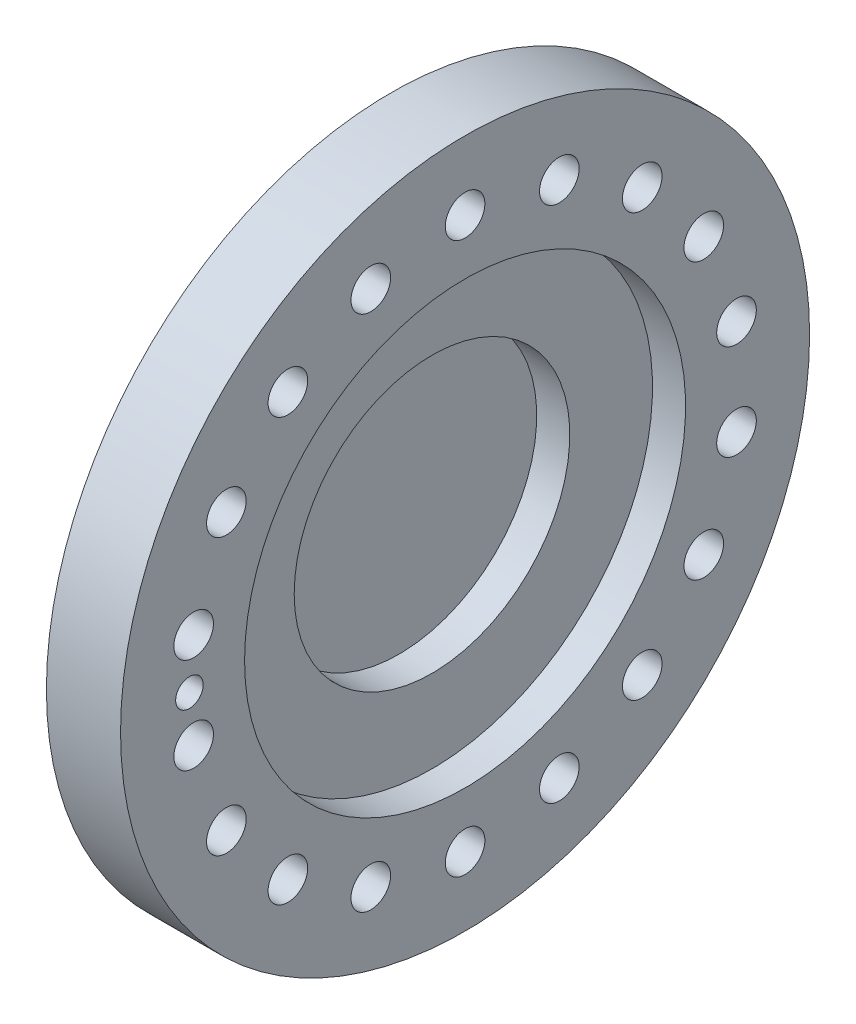
ISO-10303-21;
HEADER;
FILE_DESCRIPTION(('STEP AP214'),'2;1');
FILE_NAME('part.step','',(''),(''),'','','');
FILE_SCHEMA(('AUTOMOTIVE_DESIGN { 1 0 10303 214 1 1 1 1 }'));
ENDSEC;
DATA;
#1=APPLICATION_CONTEXT('core data for automotive mechanical design processes');
#2=APPLICATION_PROTOCOL_DEFINITION('international standard','automotive_design',2000,#1);
#3=PRODUCT_CONTEXT('',#1,'mechanical');
#4=PRODUCT('Part','Part','',(#3));
#5=PRODUCT_RELATED_PRODUCT_CATEGORY('part','',(#4));
#6=PRODUCT_DEFINITION_FORMATION('','',#4);
#7=PRODUCT_DEFINITION_CONTEXT('part definition',#1,'design');
#8=PRODUCT_DEFINITION('design','',#6,#7);
#9=PRODUCT_DEFINITION_SHAPE('','',#8);
#10=(LENGTH_UNIT() NAMED_UNIT(*) SI_UNIT(.MILLI.,.METRE.));
#11=(NAMED_UNIT(*) PLANE_ANGLE_UNIT() SI_UNIT($,.RADIAN.));
#12=(NAMED_UNIT(*) SI_UNIT($,.STERADIAN.) SOLID_ANGLE_UNIT());
#13=UNCERTAINTY_MEASURE_WITH_UNIT(LENGTH_MEASURE(1.E-05),#10,'distance_accuracy_value','');
#14=(GEOMETRIC_REPRESENTATION_CONTEXT(3) GLOBAL_UNCERTAINTY_ASSIGNED_CONTEXT((#13)) GLOBAL_UNIT_ASSIGNED_CONTEXT((#10,
#11,#12)) REPRESENTATION_CONTEXT('',''));
#15=CARTESIAN_POINT('',(0.,0.,0.));
#16=DIRECTION('',(0.,0.,1.));
#17=DIRECTION('',(1.,0.,0.));
#18=AXIS2_PLACEMENT_3D('',#15,#16,#17);
#19=CARTESIAN_POINT('',(2148.,26.0000000000061,2565.));
#20=DIRECTION('',(-1.,0.,0.));
#21=DIRECTION('',(0.,0.,1.));
#22=AXIS2_PLACEMENT_3D('',#19,#20,#21);
#23=PLANE('',#22);
#24=CARTESIAN_POINT('',(2148.,6.13918638148192E-12,2565.));
#25=DIRECTION('',(-1.,0.,0.));
#26=DIRECTION('',(0.,0.,1.));
#27=AXIS2_PLACEMENT_3D('',#24,#25,#26);
#28=CIRCLE('',#27,50.);
#29=CARTESIAN_POINT('',(2148.,6.13918638148192E-12,2615.));
#30=VERTEX_POINT('',#29);
#31=EDGE_CURVE('E149',#30,#30,#28,.T.);
#32=ORIENTED_EDGE('',*,*,#31,.F.);
#33=EDGE_LOOP('',(#32));
#34=FACE_BOUND('',#33,.T.);
#35=ADVANCED_FACE('F15',(#34),#23,.F.);
#36=CARTESIAN_POINT('',(2058.1,6.13918638148192E-12,2565.));
#37=DIRECTION('',(-1.,0.,0.));
#38=DIRECTION('',(0.,0.,1.));
#39=AXIS2_PLACEMENT_3D('',#36,#37,#38);
#40=CYLINDRICAL_SURFACE('',#39,50.);
#41=ORIENTED_EDGE('',*,*,#31,.T.);
#42=EDGE_LOOP('',(#41));
#43=FACE_BOUND('',#42,.T.);
#44=CARTESIAN_POINT('',(2160.,6.13918638148192E-12,2565.));
#45=DIRECTION('',(-1.,0.,0.));
#46=DIRECTION('',(0.,0.,1.));
#47=AXIS2_PLACEMENT_3D('',#44,#45,#46);
#48=CIRCLE('',#47,50.);
#49=CARTESIAN_POINT('',(2160.,6.13918638148192E-12,2615.));
#50=VERTEX_POINT('',#49);
#51=EDGE_CURVE('E27',#50,#50,#48,.T.);
#52=ORIENTED_EDGE('',*,*,#51,.F.);
#53=EDGE_LOOP('',(#52));
#54=FACE_BOUND('',#53,.T.);
#55=ADVANCED_FACE('F157',(#43,#54),#40,.F.);
#56=CARTESIAN_POINT('',(2160.,80.0000000000062,2565.));
#57=DIRECTION('',(1.,0.,0.));
#58=DIRECTION('',(0.,0.,-1.));
#59=AXIS2_PLACEMENT_3D('',#56,#57,#58);
#60=PLANE('',#59);
#61=ORIENTED_EDGE('',*,*,#51,.T.);
#62=EDGE_LOOP('',(#61));
#63=FACE_BOUND('',#62,.T.);
#64=CARTESIAN_POINT('',(2160.,6.13918638148192E-12,2565.));
#65=DIRECTION('',(-1.,0.,0.));
#66=DIRECTION('',(0.,0.,1.));
#67=AXIS2_PLACEMENT_3D('',#64,#65,#66);
#68=CIRCLE('',#67,80.);
#69=CARTESIAN_POINT('',(2160.,6.13918638148192E-12,2645.));
#70=VERTEX_POINT('',#69);
#71=EDGE_CURVE('E19',#70,#70,#68,.T.);
#72=ORIENTED_EDGE('',*,*,#71,.F.);
#73=EDGE_LOOP('',(#72));
#74=FACE_BOUND('',#73,.T.);
#75=ADVANCED_FACE('F154',(#63,#74),#60,.T.);
#76=CARTESIAN_POINT('',(2157.,6.11143080586629E-12,2665.));
#77=DIRECTION('',(-1.,0.,0.));
#78=DIRECTION('',(0.,0.,1.));
#79=AXIS2_PLACEMENT_3D('',#76,#77,#78);
#80=PLANE('',#79);
#81=CARTESIAN_POINT('',(2157.,6.11143080586629E-12,2665.));
#82=DIRECTION('',(-1.,0.,0.));
#83=DIRECTION('',(0.,0.,1.));
#84=AXIS2_PLACEMENT_3D('',#81,#82,#83);
#85=CIRCLE('',#84,5.);
#86=CARTESIAN_POINT('',(2157.,6.11143080586629E-12,2670.));
#87=VERTEX_POINT('',#86);
#88=EDGE_CURVE('E138',#87,#87,#85,.T.);
#89=ORIENTED_EDGE('',*,*,#88,.F.);
#90=EDGE_LOOP('',(#89));
#91=FACE_BOUND('',#90,.T.);
#92=ADVANCED_FACE('F166',(#91),#80,.F.);
#93=CARTESIAN_POINT('',(2152.,100.000000000006,2565.));
#94=DIRECTION('',(-1.,0.,0.));
#95=DIRECTION('',(0.,0.,1.));
#96=AXIS2_PLACEMENT_3D('',#93,#94,#95);
#97=PLANE('',#96);
#98=CARTESIAN_POINT('',(2152.,100.000000000006,2565.));
#99=DIRECTION('',(-1.,0.,0.));
#100=DIRECTION('',(0.,0.,1.));
#101=AXIS2_PLACEMENT_3D('',#98,#99,#100);
#102=CIRCLE('',#101,7.1881);
#103=CARTESIAN_POINT('',(2152.,100.000000000006,2572.1881));
#104=VERTEX_POINT('',#103);
#105=EDGE_CURVE('E132',#104,#104,#102,.T.);
#106=ORIENTED_EDGE('',*,*,#105,.F.);
#107=EDGE_LOOP('',(#106));
#108=FACE_BOUND('',#107,.T.);
#109=ADVANCED_FACE('F186',(#108),#97,.F.);
#110=CARTESIAN_POINT('',(2152.,93.9692620785969,2599.20201433256));
#111=DIRECTION('',(-1.,0.,0.));
#112=DIRECTION('',(0.,-0.342020143325668,0.939692620785908));
#113=AXIS2_PLACEMENT_3D('',#110,#111,#112);
#114=PLANE('',#113);
#115=CARTESIAN_POINT('',(2152.,93.9692620785969,2599.20201433256));
#116=DIRECTION('',(-1.,0.,0.));
#117=DIRECTION('',(0.,-0.342020143325668,0.939692620785908));
#118=AXIS2_PLACEMENT_3D('',#115,#116,#117);
#119=CIRCLE('',#118,7.1881);
#120=CARTESIAN_POINT('',(2152.,91.5107870863577,2605.95661886004));
#121=VERTEX_POINT('',#120);
#122=EDGE_CURVE('E126',#121,#121,#119,.T.);
#123=ORIENTED_EDGE('',*,*,#122,.F.);
#124=EDGE_LOOP('',(#123));
#125=FACE_BOUND('',#124,.T.);
#126=ADVANCED_FACE('F194',(#125),#114,.F.);
#127=CARTESIAN_POINT('',(2152.,76.604444311904,2629.27876096866));
#128=DIRECTION('',(-1.,0.,0.));
#129=DIRECTION('',(0.,-0.642787609686539,0.766044443118978));
#130=AXIS2_PLACEMENT_3D('',#127,#128,#129);
#131=PLANE('',#130);
#132=CARTESIAN_POINT('',(2152.,76.604444311904,2629.27876096866));
#133=DIRECTION('',(-1.,0.,0.));
#134=DIRECTION('',(0.,-0.642787609686539,0.766044443118978));
#135=AXIS2_PLACEMENT_3D('',#132,#133,#134);
#136=CIRCLE('',#135,7.1881);
#137=CARTESIAN_POINT('',(2152.,71.9840226947162,2634.78516503024));
#138=VERTEX_POINT('',#137);
#139=EDGE_CURVE('E120',#138,#138,#136,.T.);
#140=ORIENTED_EDGE('',*,*,#139,.F.);
#141=EDGE_LOOP('',(#140));
#142=FACE_BOUND('',#141,.T.);
#143=ADVANCED_FACE('F202',(#142),#131,.F.);
#144=CARTESIAN_POINT('',(2152.,50.0000000000061,2651.60254037844));
#145=DIRECTION('',(-1.,0.,0.));
#146=DIRECTION('',(0.,-0.866025403784439,0.5));
#147=AXIS2_PLACEMENT_3D('',#144,#145,#146);
#148=PLANE('',#147);
#149=CARTESIAN_POINT('',(2152.,50.0000000000061,2651.60254037844));
#150=DIRECTION('',(-1.,0.,0.));
#151=DIRECTION('',(0.,-0.866025403784439,0.5));
#152=AXIS2_PLACEMENT_3D('',#149,#150,#151);
#153=CIRCLE('',#152,7.1881);
#154=CARTESIAN_POINT('',(2152.,43.7749227950632,2655.19659037844));
#155=VERTEX_POINT('',#154);
#156=EDGE_CURVE('E114',#155,#155,#153,.T.);
#157=ORIENTED_EDGE('',*,*,#156,.F.);
#158=EDGE_LOOP('',(#157));
#159=FACE_BOUND('',#158,.T.);
#160=ADVANCED_FACE('F210',(#159),#148,.F.);
#161=CARTESIAN_POINT('',(2152.,17.3648177666993,2663.48077530122));
#162=DIRECTION('',(-1.,0.,0.));
#163=DIRECTION('',(0.,-0.984807753012208,0.17364817766693));
#164=AXIS2_PLACEMENT_3D('',#161,#162,#163);
#165=PLANE('',#164);
#166=CARTESIAN_POINT('',(2152.,17.3648177666993,2663.48077530122));
#167=DIRECTION('',(-1.,0.,0.));
#168=DIRECTION('',(0.,-0.984807753012208,0.17364817766693));
#169=AXIS2_PLACEMENT_3D('',#166,#167,#168);
#170=CIRCLE('',#169,7.1881);
#171=CARTESIAN_POINT('',(2152.,10.2859211572722,2664.72897576711));
#172=VERTEX_POINT('',#171);
#173=EDGE_CURVE('E108',#172,#172,#170,.T.);
#174=ORIENTED_EDGE('',*,*,#173,.F.);
#175=EDGE_LOOP('',(#174));
#176=FACE_BOUND('',#175,.T.);
#177=ADVANCED_FACE('F218',(#176),#165,.F.);
#178=CARTESIAN_POINT('',(2152.,-17.3648177666869,2663.48077530122));
#179=DIRECTION('',(-1.,0.,0.));
#180=DIRECTION('',(0.,-0.984807753012208,-0.17364817766693));
#181=AXIS2_PLACEMENT_3D('',#178,#179,#180);
#182=PLANE('',#181);
#183=CARTESIAN_POINT('',(2152.,-17.3648177666869,2663.48077530122));
#184=DIRECTION('',(-1.,0.,0.));
#185=DIRECTION('',(0.,-0.984807753012208,-0.17364817766693));
#186=AXIS2_PLACEMENT_3D('',#183,#184,#185);
#187=CIRCLE('',#186,7.1881);
#188=CARTESIAN_POINT('',(2152.,-24.4437143761139,2662.23257483533));
#189=VERTEX_POINT('',#188);
#190=EDGE_CURVE('E102',#189,#189,#187,.T.);
#191=ORIENTED_EDGE('',*,*,#190,.F.);
#192=EDGE_LOOP('',(#191));
#193=FACE_BOUND('',#192,.T.);
#194=ADVANCED_FACE('F226',(#193),#182,.F.);
#195=CARTESIAN_POINT('',(2152.,-49.9999999999939,2651.60254037844));
#196=DIRECTION('',(-1.,0.,0.));
#197=DIRECTION('',(0.,-0.866025403784439,-0.5));
#198=AXIS2_PLACEMENT_3D('',#195,#196,#197);
#199=PLANE('',#198);
#200=CARTESIAN_POINT('',(2152.,-49.9999999999939,2651.60254037844));
#201=DIRECTION('',(-1.,0.,0.));
#202=DIRECTION('',(0.,-0.866025403784439,-0.5));
#203=AXIS2_PLACEMENT_3D('',#200,#201,#202);
#204=CIRCLE('',#203,7.1881);
#205=CARTESIAN_POINT('',(2152.,-56.2250772049368,2648.00849037845));
#206=VERTEX_POINT('',#205);
#207=EDGE_CURVE('E96',#206,#206,#204,.T.);
#208=ORIENTED_EDGE('',*,*,#207,.F.);
#209=EDGE_LOOP('',(#208));
#210=FACE_BOUND('',#209,.T.);
#211=ADVANCED_FACE('F234',(#210),#199,.F.);
#212=CARTESIAN_POINT('',(2152.,-76.6044443118917,2629.27876096866));
#213=DIRECTION('',(-1.,0.,0.));
#214=DIRECTION('',(0.,-0.64278760968654,-0.766044443118978));
#215=AXIS2_PLACEMENT_3D('',#212,#213,#214);
#216=PLANE('',#215);
#217=CARTESIAN_POINT('',(2152.,-76.6044443118917,2629.27876096866));
#218=DIRECTION('',(-1.,0.,0.));
#219=DIRECTION('',(0.,-0.64278760968654,-0.766044443118978));
#220=AXIS2_PLACEMENT_3D('',#217,#218,#219);
#221=CIRCLE('',#220,7.1881);
#222=CARTESIAN_POINT('',(2152.,-81.2248659290795,2623.77235690707));
#223=VERTEX_POINT('',#222);
#224=EDGE_CURVE('E90',#223,#223,#221,.T.);
#225=ORIENTED_EDGE('',*,*,#224,.F.);
#226=EDGE_LOOP('',(#225));
#227=FACE_BOUND('',#226,.T.);
#228=ADVANCED_FACE('F242',(#227),#216,.F.);
#229=CARTESIAN_POINT('',(2152.,-93.9692620785847,2599.20201433256));
#230=DIRECTION('',(-1.,0.,0.));
#231=DIRECTION('',(0.,-0.342020143325669,-0.939692620785909));
#232=AXIS2_PLACEMENT_3D('',#229,#230,#231);
#233=PLANE('',#232);
#234=CARTESIAN_POINT('',(2152.,-93.9692620785847,2599.20201433256));
#235=DIRECTION('',(-1.,0.,0.));
#236=DIRECTION('',(0.,-0.342020143325669,-0.939692620785909));
#237=AXIS2_PLACEMENT_3D('',#234,#235,#236);
#238=CIRCLE('',#237,7.1881);
#239=CARTESIAN_POINT('',(2152.,-96.4277370708239,2592.44740980509));
#240=VERTEX_POINT('',#239);
#241=EDGE_CURVE('E84',#240,#240,#238,.T.);
#242=ORIENTED_EDGE('',*,*,#241,.F.);
#243=EDGE_LOOP('',(#242));
#244=FACE_BOUND('',#243,.T.);
#245=ADVANCED_FACE('F250',(#244),#233,.F.);
#246=CARTESIAN_POINT('',(2152.,-99.9999999999939,2565.));
#247=DIRECTION('',(-1.,0.,0.));
#248=DIRECTION('',(0.,0.,-1.));
#249=AXIS2_PLACEMENT_3D('',#246,#247,#248);
#250=PLANE('',#249);
#251=CARTESIAN_POINT('',(2152.,-99.9999999999939,2565.));
#252=DIRECTION('',(-1.,0.,0.));
#253=DIRECTION('',(0.,0.,-1.));
#254=AXIS2_PLACEMENT_3D('',#251,#252,#253);
#255=CIRCLE('',#254,7.1881);
#256=CARTESIAN_POINT('',(2152.,-99.9999999999939,2557.8119));
#257=VERTEX_POINT('',#256);
#258=EDGE_CURVE('E78',#257,#257,#255,.T.);
#259=ORIENTED_EDGE('',*,*,#258,.F.);
#260=EDGE_LOOP('',(#259));
#261=FACE_BOUND('',#260,.T.);
#262=ADVANCED_FACE('F258',(#261),#250,.F.);
#263=CARTESIAN_POINT('',(2152.,-93.9692620785848,2530.79798566744));
#264=DIRECTION('',(-1.,0.,0.));
#265=DIRECTION('',(0.,0.342020143325668,-0.939692620785909));
#266=AXIS2_PLACEMENT_3D('',#263,#264,#265);
#267=PLANE('',#266);
#268=CARTESIAN_POINT('',(2152.,-93.9692620785848,2530.79798566744));
#269=DIRECTION('',(-1.,0.,0.));
#270=DIRECTION('',(0.,0.342020143325668,-0.939692620785909));
#271=AXIS2_PLACEMENT_3D('',#268,#269,#270);
#272=CIRCLE('',#271,7.1881);
#273=CARTESIAN_POINT('',(2152.,-91.5107870863456,2524.04338113996));
#274=VERTEX_POINT('',#273);
#275=EDGE_CURVE('E72',#274,#274,#272,.T.);
#276=ORIENTED_EDGE('',*,*,#275,.F.);
#277=EDGE_LOOP('',(#276));
#278=FACE_BOUND('',#277,.T.);
#279=ADVANCED_FACE('F266',(#278),#267,.F.);
#280=CARTESIAN_POINT('',(2152.,-76.6044443118918,2500.72123903134));
#281=DIRECTION('',(-1.,0.,0.));
#282=DIRECTION('',(0.,0.642787609686539,-0.766044443118979));
#283=AXIS2_PLACEMENT_3D('',#280,#281,#282);
#284=PLANE('',#283);
#285=CARTESIAN_POINT('',(2152.,-76.6044443118918,2500.72123903134));
#286=DIRECTION('',(-1.,0.,0.));
#287=DIRECTION('',(0.,0.642787609686539,-0.766044443118979));
#288=AXIS2_PLACEMENT_3D('',#285,#286,#287);
#289=CIRCLE('',#288,7.1881);
#290=CARTESIAN_POINT('',(2152.,-71.984022694704,2495.21483496976));
#291=VERTEX_POINT('',#290);
#292=EDGE_CURVE('E66',#291,#291,#289,.T.);
#293=ORIENTED_EDGE('',*,*,#292,.F.);
#294=EDGE_LOOP('',(#293));
#295=FACE_BOUND('',#294,.T.);
#296=ADVANCED_FACE('F274',(#295),#284,.F.);
#297=CARTESIAN_POINT('',(2152.,-49.9999999999939,2478.39745962156));
#298=DIRECTION('',(-1.,0.,0.));
#299=DIRECTION('',(0.,0.866025403784439,-0.5));
#300=AXIS2_PLACEMENT_3D('',#297,#298,#299);
#301=PLANE('',#300);
#302=CARTESIAN_POINT('',(2152.,-49.9999999999939,2478.39745962156));
#303=DIRECTION('',(-1.,0.,0.));
#304=DIRECTION('',(0.,0.866025403784439,-0.5));
#305=AXIS2_PLACEMENT_3D('',#302,#303,#304);
#306=CIRCLE('',#305,7.1881);
#307=CARTESIAN_POINT('',(2152.,-43.774922795051,2474.80340962156));
#308=VERTEX_POINT('',#307);
#309=EDGE_CURVE('E60',#308,#308,#306,.T.);
#310=ORIENTED_EDGE('',*,*,#309,.F.);
#311=EDGE_LOOP('',(#310));
#312=FACE_BOUND('',#311,.T.);
#313=ADVANCED_FACE('F282',(#312),#301,.F.);
#314=CARTESIAN_POINT('',(2152.,-17.364817766687,2466.51922469878));
#315=DIRECTION('',(-1.,0.,0.));
#316=DIRECTION('',(0.,0.984807753012208,-0.173648177666931));
#317=AXIS2_PLACEMENT_3D('',#314,#315,#316);
#318=PLANE('',#317);
#319=CARTESIAN_POINT('',(2152.,-17.364817766687,2466.51922469878));
#320=DIRECTION('',(-1.,0.,0.));
#321=DIRECTION('',(0.,0.984807753012208,-0.173648177666931));
#322=AXIS2_PLACEMENT_3D('',#319,#320,#321);
#323=CIRCLE('',#322,7.1881);
#324=CARTESIAN_POINT('',(2152.,-10.2859211572599,2465.27102423289));
#325=VERTEX_POINT('',#324);
#326=EDGE_CURVE('E54',#325,#325,#323,.T.);
#327=ORIENTED_EDGE('',*,*,#326,.F.);
#328=EDGE_LOOP('',(#327));
#329=FACE_BOUND('',#328,.T.);
#330=ADVANCED_FACE('F290',(#329),#318,.F.);
#331=CARTESIAN_POINT('',(2152.,17.3648177666992,2466.51922469878));
#332=DIRECTION('',(-1.,0.,0.));
#333=DIRECTION('',(0.,0.984807753012209,0.17364817766693));
#334=AXIS2_PLACEMENT_3D('',#331,#332,#333);
#335=PLANE('',#334);
#336=CARTESIAN_POINT('',(2152.,17.3648177666992,2466.51922469878));
#337=DIRECTION('',(-1.,0.,0.));
#338=DIRECTION('',(0.,0.984807753012209,0.17364817766693));
#339=AXIS2_PLACEMENT_3D('',#336,#337,#338);
#340=CIRCLE('',#339,7.1881);
#341=CARTESIAN_POINT('',(2152.,24.4437143761262,2467.76742516467));
#342=VERTEX_POINT('',#341);
#343=EDGE_CURVE('E48',#342,#342,#340,.T.);
#344=ORIENTED_EDGE('',*,*,#343,.F.);
#345=EDGE_LOOP('',(#344));
#346=FACE_BOUND('',#345,.T.);
#347=ADVANCED_FACE('F298',(#346),#335,.F.);
#348=CARTESIAN_POINT('',(2152.,50.0000000000061,2478.39745962156));
#349=DIRECTION('',(-1.,0.,0.));
#350=DIRECTION('',(0.,0.866025403784439,0.5));
#351=AXIS2_PLACEMENT_3D('',#348,#349,#350);
#352=PLANE('',#351);
#353=CARTESIAN_POINT('',(2152.,50.0000000000061,2478.39745962156));
#354=DIRECTION('',(-1.,0.,0.));
#355=DIRECTION('',(0.,0.866025403784439,0.5));
#356=AXIS2_PLACEMENT_3D('',#353,#354,#355);
#357=CIRCLE('',#356,7.1881);
#358=CARTESIAN_POINT('',(2152.,56.225077204949,2481.99150962155));
#359=VERTEX_POINT('',#358);
#360=EDGE_CURVE('E42',#359,#359,#357,.T.);
#361=ORIENTED_EDGE('',*,*,#360,.F.);
#362=EDGE_LOOP('',(#361));
#363=FACE_BOUND('',#362,.T.);
#364=ADVANCED_FACE('F306',(#363),#352,.F.);
#365=CARTESIAN_POINT('',(2152.,76.6044443119041,2500.72123903134));
#366=DIRECTION('',(-1.,0.,0.));
#367=DIRECTION('',(0.,0.64278760968654,0.766044443118978));
#368=AXIS2_PLACEMENT_3D('',#365,#366,#367);
#369=PLANE('',#368);
#370=CARTESIAN_POINT('',(2152.,76.6044443119041,2500.72123903134));
#371=DIRECTION('',(-1.,0.,0.));
#372=DIRECTION('',(0.,0.64278760968654,0.766044443118978));
#373=AXIS2_PLACEMENT_3D('',#370,#371,#372);
#374=CIRCLE('',#373,7.1881);
#375=CARTESIAN_POINT('',(2152.,81.2248659290919,2506.22764309293));
#376=VERTEX_POINT('',#375);
#377=EDGE_CURVE('E36',#376,#376,#374,.T.);
#378=ORIENTED_EDGE('',*,*,#377,.F.);
#379=EDGE_LOOP('',(#378));
#380=FACE_BOUND('',#379,.T.);
#381=ADVANCED_FACE('F314',(#380),#369,.F.);
#382=CARTESIAN_POINT('',(2152.,93.969262078597,2530.79798566743));
#383=DIRECTION('',(-1.,0.,0.));
#384=DIRECTION('',(0.,0.342020143325669,0.939692620785909));
#385=AXIS2_PLACEMENT_3D('',#382,#383,#384);
#386=PLANE('',#385);
#387=CARTESIAN_POINT('',(2152.,93.969262078597,2530.79798566743));
#388=DIRECTION('',(-1.,0.,0.));
#389=DIRECTION('',(0.,0.342020143325669,0.939692620785909));
#390=AXIS2_PLACEMENT_3D('',#387,#388,#389);
#391=CIRCLE('',#390,7.1881);
#392=CARTESIAN_POINT('',(2152.,96.4277370708363,2537.5525901949));
#393=VERTEX_POINT('',#392);
#394=EDGE_CURVE('E29',#393,#393,#391,.T.);
#395=ORIENTED_EDGE('',*,*,#394,.F.);
#396=EDGE_LOOP('',(#395));
#397=FACE_BOUND('',#396,.T.);
#398=ADVANCED_FACE('F321',(#397),#386,.F.);
#399=CARTESIAN_POINT('',(2058.1,6.13918638148192E-12,2565.));
#400=DIRECTION('',(-1.,0.,0.));
#401=DIRECTION('',(0.,0.,1.));
#402=AXIS2_PLACEMENT_3D('',#399,#400,#401);
#403=CYLINDRICAL_SURFACE('',#402,80.);
#404=ORIENTED_EDGE('',*,*,#71,.T.);
#405=EDGE_LOOP('',(#404));
#406=FACE_BOUND('',#405,.T.);
#407=CARTESIAN_POINT('',(2172.,6.13918638148192E-12,2565.));
#408=DIRECTION('',(-1.,0.,0.));
#409=DIRECTION('',(0.,0.,1.));
#410=AXIS2_PLACEMENT_3D('',#407,#408,#409);
#411=CIRCLE('',#410,80.);
#412=CARTESIAN_POINT('',(2172.,6.13918638148192E-12,2645.));
#413=VERTEX_POINT('',#412);
#414=EDGE_CURVE('E141',#413,#413,#411,.T.);
#415=ORIENTED_EDGE('',*,*,#414,.F.);
#416=EDGE_LOOP('',(#415));
#417=FACE_BOUND('',#416,.T.);
#418=ADVANCED_FACE('F17',(#406,#417),#403,.F.);
#419=CARTESIAN_POINT('',(2172.,6.11143080586629E-12,2665.));
#420=DIRECTION('',(-1.,0.,0.));
#421=DIRECTION('',(0.,0.,1.));
#422=AXIS2_PLACEMENT_3D('',#419,#420,#421);
#423=CYLINDRICAL_SURFACE('',#422,5.);
#424=ORIENTED_EDGE('',*,*,#88,.T.);
#425=EDGE_LOOP('',(#424));
#426=FACE_BOUND('',#425,.T.);
#427=CARTESIAN_POINT('',(2172.,6.11143080586629E-12,2665.));
#428=DIRECTION('',(-1.,0.,0.));
#429=DIRECTION('',(0.,0.,1.));
#430=AXIS2_PLACEMENT_3D('',#427,#428,#429);
#431=CIRCLE('',#430,5.);
#432=CARTESIAN_POINT('',(2172.,6.11143080586629E-12,2670.));
#433=VERTEX_POINT('',#432);
#434=EDGE_CURVE('E135',#433,#433,#431,.T.);
#435=ORIENTED_EDGE('',*,*,#434,.F.);
#436=EDGE_LOOP('',(#435));
#437=FACE_BOUND('',#436,.T.);
#438=ADVANCED_FACE('F179',(#426,#437),#423,.F.);
#439=CARTESIAN_POINT('',(2172.,100.000000000006,2565.));
#440=DIRECTION('',(-1.,0.,0.));
#441=DIRECTION('',(0.,0.,1.));
#442=AXIS2_PLACEMENT_3D('',#439,#440,#441);
#443=CYLINDRICAL_SURFACE('',#442,7.1881);
#444=ORIENTED_EDGE('',*,*,#105,.T.);
#445=EDGE_LOOP('',(#444));
#446=FACE_BOUND('',#445,.T.);
#447=CARTESIAN_POINT('',(2172.,100.000000000006,2565.));
#448=DIRECTION('',(-1.,0.,0.));
#449=DIRECTION('',(0.,0.,1.));
#450=AXIS2_PLACEMENT_3D('',#447,#448,#449);
#451=CIRCLE('',#450,7.1881);
#452=CARTESIAN_POINT('',(2172.,100.000000000006,2572.1881));
#453=VERTEX_POINT('',#452);
#454=EDGE_CURVE('E129',#453,#453,#451,.T.);
#455=ORIENTED_EDGE('',*,*,#454,.F.);
#456=EDGE_LOOP('',(#455));
#457=FACE_BOUND('',#456,.T.);
#458=ADVANCED_FACE('F182',(#446,#457),#443,.F.);
#459=CARTESIAN_POINT('',(2172.,93.9692620785969,2599.20201433256));
#460=DIRECTION('',(-1.,0.,0.));
#461=DIRECTION('',(0.,-0.342020143325668,0.939692620785908));
#462=AXIS2_PLACEMENT_3D('',#459,#460,#461);
#463=CYLINDRICAL_SURFACE('',#462,7.1881);
#464=ORIENTED_EDGE('',*,*,#122,.T.);
#465=EDGE_LOOP('',(#464));
#466=FACE_BOUND('',#465,.T.);
#467=CARTESIAN_POINT('',(2172.,93.9692620785969,2599.20201433256));
#468=DIRECTION('',(-1.,0.,0.));
#469=DIRECTION('',(0.,-0.342020143325668,0.939692620785908));
#470=AXIS2_PLACEMENT_3D('',#467,#468,#469);
#471=CIRCLE('',#470,7.1881);
#472=CARTESIAN_POINT('',(2172.,91.5107870863577,2605.95661886004));
#473=VERTEX_POINT('',#472);
#474=EDGE_CURVE('E123',#473,#473,#471,.T.);
#475=ORIENTED_EDGE('',*,*,#474,.F.);
#476=EDGE_LOOP('',(#475));
#477=FACE_BOUND('',#476,.T.);
#478=ADVANCED_FACE('F190',(#466,#477),#463,.F.);
#479=CARTESIAN_POINT('',(2172.,76.604444311904,2629.27876096866));
#480=DIRECTION('',(-1.,0.,0.));
#481=DIRECTION('',(0.,-0.642787609686539,0.766044443118978));
#482=AXIS2_PLACEMENT_3D('',#479,#480,#481);
#483=CYLINDRICAL_SURFACE('',#482,7.1881);
#484=ORIENTED_EDGE('',*,*,#139,.T.);
#485=EDGE_LOOP('',(#484));
#486=FACE_BOUND('',#485,.T.);
#487=CARTESIAN_POINT('',(2172.,76.604444311904,2629.27876096866));
#488=DIRECTION('',(-1.,0.,0.));
#489=DIRECTION('',(0.,-0.642787609686539,0.766044443118978));
#490=AXIS2_PLACEMENT_3D('',#487,#488,#489);
#491=CIRCLE('',#490,7.1881);
#492=CARTESIAN_POINT('',(2172.,71.9840226947162,2634.78516503024));
#493=VERTEX_POINT('',#492);
#494=EDGE_CURVE('E117',#493,#493,#491,.T.);
#495=ORIENTED_EDGE('',*,*,#494,.F.);
#496=EDGE_LOOP('',(#495));
#497=FACE_BOUND('',#496,.T.);
#498=ADVANCED_FACE('F198',(#486,#497),#483,.F.);
#499=CARTESIAN_POINT('',(2172.,50.0000000000061,2651.60254037844));
#500=DIRECTION('',(-1.,0.,0.));
#501=DIRECTION('',(0.,-0.866025403784439,0.5));
#502=AXIS2_PLACEMENT_3D('',#499,#500,#501);
#503=CYLINDRICAL_SURFACE('',#502,7.1881);
#504=ORIENTED_EDGE('',*,*,#156,.T.);
#505=EDGE_LOOP('',(#504));
#506=FACE_BOUND('',#505,.T.);
#507=CARTESIAN_POINT('',(2172.,50.0000000000061,2651.60254037844));
#508=DIRECTION('',(-1.,0.,0.));
#509=DIRECTION('',(0.,-0.866025403784439,0.5));
#510=AXIS2_PLACEMENT_3D('',#507,#508,#509);
#511=CIRCLE('',#510,7.1881);
#512=CARTESIAN_POINT('',(2172.,43.7749227950632,2655.19659037844));
#513=VERTEX_POINT('',#512);
#514=EDGE_CURVE('E111',#513,#513,#511,.T.);
#515=ORIENTED_EDGE('',*,*,#514,.F.);
#516=EDGE_LOOP('',(#515));
#517=FACE_BOUND('',#516,.T.);
#518=ADVANCED_FACE('F206',(#506,#517),#503,.F.);
#519=CARTESIAN_POINT('',(2172.,17.3648177666993,2663.48077530122));
#520=DIRECTION('',(-1.,0.,0.));
#521=DIRECTION('',(0.,-0.984807753012208,0.17364817766693));
#522=AXIS2_PLACEMENT_3D('',#519,#520,#521);
#523=CYLINDRICAL_SURFACE('',#522,7.1881);
#524=ORIENTED_EDGE('',*,*,#173,.T.);
#525=EDGE_LOOP('',(#524));
#526=FACE_BOUND('',#525,.T.);
#527=CARTESIAN_POINT('',(2172.,17.3648177666993,2663.48077530122));
#528=DIRECTION('',(-1.,0.,0.));
#529=DIRECTION('',(0.,-0.984807753012208,0.17364817766693));
#530=AXIS2_PLACEMENT_3D('',#527,#528,#529);
#531=CIRCLE('',#530,7.1881);
#532=CARTESIAN_POINT('',(2172.,10.2859211572722,2664.72897576711));
#533=VERTEX_POINT('',#532);
#534=EDGE_CURVE('E105',#533,#533,#531,.T.);
#535=ORIENTED_EDGE('',*,*,#534,.F.);
#536=EDGE_LOOP('',(#535));
#537=FACE_BOUND('',#536,.T.);
#538=ADVANCED_FACE('F214',(#526,#537),#523,.F.);
#539=CARTESIAN_POINT('',(2172.,-17.3648177666869,2663.48077530122));
#540=DIRECTION('',(-1.,0.,0.));
#541=DIRECTION('',(0.,-0.984807753012208,-0.17364817766693));
#542=AXIS2_PLACEMENT_3D('',#539,#540,#541);
#543=CYLINDRICAL_SURFACE('',#542,7.1881);
#544=ORIENTED_EDGE('',*,*,#190,.T.);
#545=EDGE_LOOP('',(#544));
#546=FACE_BOUND('',#545,.T.);
#547=CARTESIAN_POINT('',(2172.,-17.3648177666869,2663.48077530122));
#548=DIRECTION('',(-1.,0.,0.));
#549=DIRECTION('',(0.,-0.984807753012208,-0.17364817766693));
#550=AXIS2_PLACEMENT_3D('',#547,#548,#549);
#551=CIRCLE('',#550,7.1881);
#552=CARTESIAN_POINT('',(2172.,-24.4437143761139,2662.23257483533));
#553=VERTEX_POINT('',#552);
#554=EDGE_CURVE('E99',#553,#553,#551,.T.);
#555=ORIENTED_EDGE('',*,*,#554,.F.);
#556=EDGE_LOOP('',(#555));
#557=FACE_BOUND('',#556,.T.);
#558=ADVANCED_FACE('F222',(#546,#557),#543,.F.);
#559=CARTESIAN_POINT('',(2172.,-49.9999999999939,2651.60254037844));
#560=DIRECTION('',(-1.,0.,0.));
#561=DIRECTION('',(0.,-0.866025403784439,-0.5));
#562=AXIS2_PLACEMENT_3D('',#559,#560,#561);
#563=CYLINDRICAL_SURFACE('',#562,7.1881);
#564=ORIENTED_EDGE('',*,*,#207,.T.);
#565=EDGE_LOOP('',(#564));
#566=FACE_BOUND('',#565,.T.);
#567=CARTESIAN_POINT('',(2172.,-49.9999999999939,2651.60254037844));
#568=DIRECTION('',(-1.,0.,0.));
#569=DIRECTION('',(0.,-0.866025403784439,-0.5));
#570=AXIS2_PLACEMENT_3D('',#567,#568,#569);
#571=CIRCLE('',#570,7.1881);
#572=CARTESIAN_POINT('',(2172.,-56.2250772049368,2648.00849037845));
#573=VERTEX_POINT('',#572);
#574=EDGE_CURVE('E93',#573,#573,#571,.T.);
#575=ORIENTED_EDGE('',*,*,#574,.F.);
#576=EDGE_LOOP('',(#575));
#577=FACE_BOUND('',#576,.T.);
#578=ADVANCED_FACE('F230',(#566,#577),#563,.F.);
#579=CARTESIAN_POINT('',(2172.,-76.6044443118917,2629.27876096866));
#580=DIRECTION('',(-1.,0.,0.));
#581=DIRECTION('',(0.,-0.64278760968654,-0.766044443118978));
#582=AXIS2_PLACEMENT_3D('',#579,#580,#581);
#583=CYLINDRICAL_SURFACE('',#582,7.1881);
#584=ORIENTED_EDGE('',*,*,#224,.T.);
#585=EDGE_LOOP('',(#584));
#586=FACE_BOUND('',#585,.T.);
#587=CARTESIAN_POINT('',(2172.,-76.6044443118917,2629.27876096866));
#588=DIRECTION('',(-1.,0.,0.));
#589=DIRECTION('',(0.,-0.64278760968654,-0.766044443118978));
#590=AXIS2_PLACEMENT_3D('',#587,#588,#589);
#591=CIRCLE('',#590,7.1881);
#592=CARTESIAN_POINT('',(2172.,-81.2248659290795,2623.77235690707));
#593=VERTEX_POINT('',#592);
#594=EDGE_CURVE('E87',#593,#593,#591,.T.);
#595=ORIENTED_EDGE('',*,*,#594,.F.);
#596=EDGE_LOOP('',(#595));
#597=FACE_BOUND('',#596,.T.);
#598=ADVANCED_FACE('F238',(#586,#597),#583,.F.);
#599=CARTESIAN_POINT('',(2172.,-93.9692620785847,2599.20201433256));
#600=DIRECTION('',(-1.,0.,0.));
#601=DIRECTION('',(0.,-0.342020143325669,-0.939692620785909));
#602=AXIS2_PLACEMENT_3D('',#599,#600,#601);
#603=CYLINDRICAL_SURFACE('',#602,7.1881);
#604=ORIENTED_EDGE('',*,*,#241,.T.);
#605=EDGE_LOOP('',(#604));
#606=FACE_BOUND('',#605,.T.);
#607=CARTESIAN_POINT('',(2172.,-93.9692620785847,2599.20201433256));
#608=DIRECTION('',(-1.,0.,0.));
#609=DIRECTION('',(0.,-0.342020143325669,-0.939692620785909));
#610=AXIS2_PLACEMENT_3D('',#607,#608,#609);
#611=CIRCLE('',#610,7.1881);
#612=CARTESIAN_POINT('',(2172.,-96.4277370708239,2592.44740980509));
#613=VERTEX_POINT('',#612);
#614=EDGE_CURVE('E81',#613,#613,#611,.T.);
#615=ORIENTED_EDGE('',*,*,#614,.F.);
#616=EDGE_LOOP('',(#615));
#617=FACE_BOUND('',#616,.T.);
#618=ADVANCED_FACE('F246',(#606,#617),#603,.F.);
#619=CARTESIAN_POINT('',(2172.,-99.9999999999939,2565.));
#620=DIRECTION('',(-1.,0.,0.));
#621=DIRECTION('',(0.,0.,-1.));
#622=AXIS2_PLACEMENT_3D('',#619,#620,#621);
#623=CYLINDRICAL_SURFACE('',#622,7.1881);
#624=ORIENTED_EDGE('',*,*,#258,.T.);
#625=EDGE_LOOP('',(#624));
#626=FACE_BOUND('',#625,.T.);
#627=CARTESIAN_POINT('',(2172.,-99.9999999999939,2565.));
#628=DIRECTION('',(-1.,0.,0.));
#629=DIRECTION('',(0.,0.,-1.));
#630=AXIS2_PLACEMENT_3D('',#627,#628,#629);
#631=CIRCLE('',#630,7.1881);
#632=CARTESIAN_POINT('',(2172.,-99.9999999999939,2557.8119));
#633=VERTEX_POINT('',#632);
#634=EDGE_CURVE('E75',#633,#633,#631,.T.);
#635=ORIENTED_EDGE('',*,*,#634,.F.);
#636=EDGE_LOOP('',(#635));
#637=FACE_BOUND('',#636,.T.);
#638=ADVANCED_FACE('F254',(#626,#637),#623,.F.);
#639=CARTESIAN_POINT('',(2172.,-93.9692620785848,2530.79798566744));
#640=DIRECTION('',(-1.,0.,0.));
#641=DIRECTION('',(0.,0.342020143325668,-0.939692620785909));
#642=AXIS2_PLACEMENT_3D('',#639,#640,#641);
#643=CYLINDRICAL_SURFACE('',#642,7.1881);
#644=ORIENTED_EDGE('',*,*,#275,.T.);
#645=EDGE_LOOP('',(#644));
#646=FACE_BOUND('',#645,.T.);
#647=CARTESIAN_POINT('',(2172.,-93.9692620785848,2530.79798566744));
#648=DIRECTION('',(-1.,0.,0.));
#649=DIRECTION('',(0.,0.342020143325668,-0.939692620785909));
#650=AXIS2_PLACEMENT_3D('',#647,#648,#649);
#651=CIRCLE('',#650,7.1881);
#652=CARTESIAN_POINT('',(2172.,-91.5107870863456,2524.04338113996));
#653=VERTEX_POINT('',#652);
#654=EDGE_CURVE('E69',#653,#653,#651,.T.);
#655=ORIENTED_EDGE('',*,*,#654,.F.);
#656=EDGE_LOOP('',(#655));
#657=FACE_BOUND('',#656,.T.);
#658=ADVANCED_FACE('F262',(#646,#657),#643,.F.);
#659=CARTESIAN_POINT('',(2172.,-76.6044443118918,2500.72123903134));
#660=DIRECTION('',(-1.,0.,0.));
#661=DIRECTION('',(0.,0.642787609686539,-0.766044443118979));
#662=AXIS2_PLACEMENT_3D('',#659,#660,#661);
#663=CYLINDRICAL_SURFACE('',#662,7.1881);
#664=ORIENTED_EDGE('',*,*,#292,.T.);
#665=EDGE_LOOP('',(#664));
#666=FACE_BOUND('',#665,.T.);
#667=CARTESIAN_POINT('',(2172.,-76.6044443118918,2500.72123903134));
#668=DIRECTION('',(-1.,0.,0.));
#669=DIRECTION('',(0.,0.642787609686539,-0.766044443118979));
#670=AXIS2_PLACEMENT_3D('',#667,#668,#669);
#671=CIRCLE('',#670,7.1881);
#672=CARTESIAN_POINT('',(2172.,-71.984022694704,2495.21483496976));
#673=VERTEX_POINT('',#672);
#674=EDGE_CURVE('E63',#673,#673,#671,.T.);
#675=ORIENTED_EDGE('',*,*,#674,.F.);
#676=EDGE_LOOP('',(#675));
#677=FACE_BOUND('',#676,.T.);
#678=ADVANCED_FACE('F270',(#666,#677),#663,.F.);
#679=CARTESIAN_POINT('',(2172.,-49.9999999999939,2478.39745962156));
#680=DIRECTION('',(-1.,0.,0.));
#681=DIRECTION('',(0.,0.866025403784439,-0.5));
#682=AXIS2_PLACEMENT_3D('',#679,#680,#681);
#683=CYLINDRICAL_SURFACE('',#682,7.1881);
#684=ORIENTED_EDGE('',*,*,#309,.T.);
#685=EDGE_LOOP('',(#684));
#686=FACE_BOUND('',#685,.T.);
#687=CARTESIAN_POINT('',(2172.,-49.9999999999939,2478.39745962156));
#688=DIRECTION('',(-1.,0.,0.));
#689=DIRECTION('',(0.,0.866025403784439,-0.5));
#690=AXIS2_PLACEMENT_3D('',#687,#688,#689);
#691=CIRCLE('',#690,7.1881);
#692=CARTESIAN_POINT('',(2172.,-43.774922795051,2474.80340962156));
#693=VERTEX_POINT('',#692);
#694=EDGE_CURVE('E57',#693,#693,#691,.T.);
#695=ORIENTED_EDGE('',*,*,#694,.F.);
#696=EDGE_LOOP('',(#695));
#697=FACE_BOUND('',#696,.T.);
#698=ADVANCED_FACE('F278',(#686,#697),#683,.F.);
#699=CARTESIAN_POINT('',(2172.,-17.364817766687,2466.51922469878));
#700=DIRECTION('',(-1.,0.,0.));
#701=DIRECTION('',(0.,0.984807753012208,-0.173648177666931));
#702=AXIS2_PLACEMENT_3D('',#699,#700,#701);
#703=CYLINDRICAL_SURFACE('',#702,7.1881);
#704=ORIENTED_EDGE('',*,*,#326,.T.);
#705=EDGE_LOOP('',(#704));
#706=FACE_BOUND('',#705,.T.);
#707=CARTESIAN_POINT('',(2172.,-17.364817766687,2466.51922469878));
#708=DIRECTION('',(-1.,0.,0.));
#709=DIRECTION('',(0.,0.984807753012208,-0.173648177666931));
#710=AXIS2_PLACEMENT_3D('',#707,#708,#709);
#711=CIRCLE('',#710,7.1881);
#712=CARTESIAN_POINT('',(2172.,-10.2859211572599,2465.27102423289));
#713=VERTEX_POINT('',#712);
#714=EDGE_CURVE('E51',#713,#713,#711,.T.);
#715=ORIENTED_EDGE('',*,*,#714,.F.);
#716=EDGE_LOOP('',(#715));
#717=FACE_BOUND('',#716,.T.);
#718=ADVANCED_FACE('F286',(#706,#717),#703,.F.);
#719=CARTESIAN_POINT('',(2172.,17.3648177666992,2466.51922469878));
#720=DIRECTION('',(-1.,0.,0.));
#721=DIRECTION('',(0.,0.984807753012209,0.17364817766693));
#722=AXIS2_PLACEMENT_3D('',#719,#720,#721);
#723=CYLINDRICAL_SURFACE('',#722,7.1881);
#724=ORIENTED_EDGE('',*,*,#343,.T.);
#725=EDGE_LOOP('',(#724));
#726=FACE_BOUND('',#725,.T.);
#727=CARTESIAN_POINT('',(2172.,17.3648177666992,2466.51922469878));
#728=DIRECTION('',(-1.,0.,0.));
#729=DIRECTION('',(0.,0.984807753012209,0.17364817766693));
#730=AXIS2_PLACEMENT_3D('',#727,#728,#729);
#731=CIRCLE('',#730,7.1881);
#732=CARTESIAN_POINT('',(2172.,24.4437143761262,2467.76742516467));
#733=VERTEX_POINT('',#732);
#734=EDGE_CURVE('E45',#733,#733,#731,.T.);
#735=ORIENTED_EDGE('',*,*,#734,.F.);
#736=EDGE_LOOP('',(#735));
#737=FACE_BOUND('',#736,.T.);
#738=ADVANCED_FACE('F294',(#726,#737),#723,.F.);
#739=CARTESIAN_POINT('',(2172.,50.0000000000061,2478.39745962156));
#740=DIRECTION('',(-1.,0.,0.));
#741=DIRECTION('',(0.,0.866025403784439,0.5));
#742=AXIS2_PLACEMENT_3D('',#739,#740,#741);
#743=CYLINDRICAL_SURFACE('',#742,7.1881);
#744=ORIENTED_EDGE('',*,*,#360,.T.);
#745=EDGE_LOOP('',(#744));
#746=FACE_BOUND('',#745,.T.);
#747=CARTESIAN_POINT('',(2172.,50.0000000000061,2478.39745962156));
#748=DIRECTION('',(-1.,0.,0.));
#749=DIRECTION('',(0.,0.866025403784439,0.5));
#750=AXIS2_PLACEMENT_3D('',#747,#748,#749);
#751=CIRCLE('',#750,7.1881);
#752=CARTESIAN_POINT('',(2172.,56.225077204949,2481.99150962155));
#753=VERTEX_POINT('',#752);
#754=EDGE_CURVE('E39',#753,#753,#751,.T.);
#755=ORIENTED_EDGE('',*,*,#754,.F.);
#756=EDGE_LOOP('',(#755));
#757=FACE_BOUND('',#756,.T.);
#758=ADVANCED_FACE('F302',(#746,#757),#743,.F.);
#759=CARTESIAN_POINT('',(2172.,76.6044443119041,2500.72123903134));
#760=DIRECTION('',(-1.,0.,0.));
#761=DIRECTION('',(0.,0.64278760968654,0.766044443118978));
#762=AXIS2_PLACEMENT_3D('',#759,#760,#761);
#763=CYLINDRICAL_SURFACE('',#762,7.1881);
#764=ORIENTED_EDGE('',*,*,#377,.T.);
#765=EDGE_LOOP('',(#764));
#766=FACE_BOUND('',#765,.T.);
#767=CARTESIAN_POINT('',(2172.,76.6044443119041,2500.72123903134));
#768=DIRECTION('',(-1.,0.,0.));
#769=DIRECTION('',(0.,0.64278760968654,0.766044443118978));
#770=AXIS2_PLACEMENT_3D('',#767,#768,#769);
#771=CIRCLE('',#770,7.1881);
#772=CARTESIAN_POINT('',(2172.,81.2248659290919,2506.22764309293));
#773=VERTEX_POINT('',#772);
#774=EDGE_CURVE('E32',#773,#773,#771,.T.);
#775=ORIENTED_EDGE('',*,*,#774,.F.);
#776=EDGE_LOOP('',(#775));
#777=FACE_BOUND('',#776,.T.);
#778=ADVANCED_FACE('F310',(#766,#777),#763,.F.);
#779=CARTESIAN_POINT('',(2172.,93.969262078597,2530.79798566743));
#780=DIRECTION('',(-1.,0.,0.));
#781=DIRECTION('',(0.,0.342020143325669,0.939692620785909));
#782=AXIS2_PLACEMENT_3D('',#779,#780,#781);
#783=CYLINDRICAL_SURFACE('',#782,7.1881);
#784=ORIENTED_EDGE('',*,*,#394,.T.);
#785=EDGE_LOOP('',(#784));
#786=FACE_BOUND('',#785,.T.);
#787=CARTESIAN_POINT('',(2172.,93.969262078597,2530.79798566743));
#788=DIRECTION('',(-1.,0.,0.));
#789=DIRECTION('',(0.,0.342020143325669,0.939692620785909));
#790=AXIS2_PLACEMENT_3D('',#787,#788,#789);
#791=CIRCLE('',#790,7.1881);
#792=CARTESIAN_POINT('',(2172.,96.4277370708363,2537.5525901949));
#793=VERTEX_POINT('',#792);
#794=EDGE_CURVE('E33',#793,#793,#791,.T.);
#795=ORIENTED_EDGE('',*,*,#794,.F.);
#796=EDGE_LOOP('',(#795));
#797=FACE_BOUND('',#796,.T.);
#798=ADVANCED_FACE('F177',(#786,#797),#783,.F.);
#799=CARTESIAN_POINT('',(2172.,80.0000000000062,2565.));
#800=DIRECTION('',(-1.,0.,0.));
#801=DIRECTION('',(0.,0.,1.));
#802=AXIS2_PLACEMENT_3D('',#799,#800,#801);
#803=PLANE('',#802);
#804=ORIENTED_EDGE('',*,*,#794,.T.);
#805=EDGE_LOOP('',(#804));
#806=FACE_BOUND('',#805,.T.);
#807=ORIENTED_EDGE('',*,*,#774,.T.);
#808=EDGE_LOOP('',(#807));
#809=FACE_BOUND('',#808,.T.);
#810=ORIENTED_EDGE('',*,*,#754,.T.);
#811=EDGE_LOOP('',(#810));
#812=FACE_BOUND('',#811,.T.);
#813=ORIENTED_EDGE('',*,*,#734,.T.);
#814=EDGE_LOOP('',(#813));
#815=FACE_BOUND('',#814,.T.);
#816=ORIENTED_EDGE('',*,*,#714,.T.);
#817=EDGE_LOOP('',(#816));
#818=FACE_BOUND('',#817,.T.);
#819=ORIENTED_EDGE('',*,*,#694,.T.);
#820=EDGE_LOOP('',(#819));
#821=FACE_BOUND('',#820,.T.);
#822=ORIENTED_EDGE('',*,*,#674,.T.);
#823=EDGE_LOOP('',(#822));
#824=FACE_BOUND('',#823,.T.);
#825=ORIENTED_EDGE('',*,*,#654,.T.);
#826=EDGE_LOOP('',(#825));
#827=FACE_BOUND('',#826,.T.);
#828=ORIENTED_EDGE('',*,*,#634,.T.);
#829=EDGE_LOOP('',(#828));
#830=FACE_BOUND('',#829,.T.);
#831=ORIENTED_EDGE('',*,*,#614,.T.);
#832=EDGE_LOOP('',(#831));
#833=FACE_BOUND('',#832,.T.);
#834=ORIENTED_EDGE('',*,*,#594,.T.);
#835=EDGE_LOOP('',(#834));
#836=FACE_BOUND('',#835,.T.);
#837=ORIENTED_EDGE('',*,*,#574,.T.);
#838=EDGE_LOOP('',(#837));
#839=FACE_BOUND('',#838,.T.);
#840=ORIENTED_EDGE('',*,*,#554,.T.);
#841=EDGE_LOOP('',(#840));
#842=FACE_BOUND('',#841,.T.);
#843=ORIENTED_EDGE('',*,*,#534,.T.);
#844=EDGE_LOOP('',(#843));
#845=FACE_BOUND('',#844,.T.);
#846=ORIENTED_EDGE('',*,*,#514,.T.);
#847=EDGE_LOOP('',(#846));
#848=FACE_BOUND('',#847,.T.);
#849=ORIENTED_EDGE('',*,*,#494,.T.);
#850=EDGE_LOOP('',(#849));
#851=FACE_BOUND('',#850,.T.);
#852=ORIENTED_EDGE('',*,*,#474,.T.);
#853=EDGE_LOOP('',(#852));
#854=FACE_BOUND('',#853,.T.);
#855=ORIENTED_EDGE('',*,*,#454,.T.);
#856=EDGE_LOOP('',(#855));
#857=FACE_BOUND('',#856,.T.);
#858=ORIENTED_EDGE('',*,*,#434,.T.);
#859=EDGE_LOOP('',(#858));
#860=FACE_BOUND('',#859,.T.);
#861=CARTESIAN_POINT('',(2172.,6.13918638148192E-12,2565.));
#862=DIRECTION('',(-1.,0.,0.));
#863=DIRECTION('',(0.,0.,1.));
#864=AXIS2_PLACEMENT_3D('',#861,#862,#863);
#865=CIRCLE('',#864,125.);
#866=CARTESIAN_POINT('',(2172.,6.13918638148192E-12,2690.));
#867=VERTEX_POINT('',#866);
#868=EDGE_CURVE('E146',#867,#867,#865,.T.);
#869=ORIENTED_EDGE('',*,*,#868,.F.);
#870=EDGE_LOOP('',(#869));
#871=FACE_BOUND('',#870,.T.);
#872=ORIENTED_EDGE('',*,*,#414,.T.);
#873=EDGE_LOOP('',(#872));
#874=FACE_BOUND('',#873,.T.);
#875=ADVANCED_FACE('F174',(#806,#809,#812,#815,#818,#821,#824,#827,#830,#833,#836,#839,#842,
#845,#848,#851,#854,#857,#860,#871,#874),#803,.F.);
#876=CARTESIAN_POINT('',(2058.1,6.13918638148192E-12,2565.));
#877=DIRECTION('',(-1.,0.,0.));
#878=DIRECTION('',(0.,0.,1.));
#879=AXIS2_PLACEMENT_3D('',#876,#877,#878);
#880=CYLINDRICAL_SURFACE('',#879,125.);
#881=CARTESIAN_POINT('',(2145.1,6.13918638148192E-12,2565.));
#882=DIRECTION('',(1.,0.,0.));
#883=DIRECTION('',(0.,0.,-1.));
#884=AXIS2_PLACEMENT_3D('',#881,#882,#883);
#885=CIRCLE('',#884,125.);
#886=CARTESIAN_POINT('',(2145.1,6.13918638148192E-12,2440.));
#887=VERTEX_POINT('',#886);
#888=EDGE_CURVE('E10',#887,#887,#885,.T.);
#889=ORIENTED_EDGE('',*,*,#888,.T.);
#890=EDGE_LOOP('',(#889));
#891=FACE_BOUND('',#890,.T.);
#892=ORIENTED_EDGE('',*,*,#868,.T.);
#893=EDGE_LOOP('',(#892));
#894=FACE_BOUND('',#893,.T.);
#895=ADVANCED_FACE('F170',(#891,#894),#880,.T.);
#896=CARTESIAN_POINT('',(2145.1,6.13918638148192E-12,2565.));
#897=DIRECTION('',(1.,0.,0.));
#898=DIRECTION('',(0.,0.,-1.));
#899=AXIS2_PLACEMENT_3D('',#896,#897,#898);
#900=PLANE('',#899);
#901=ORIENTED_EDGE('',*,*,#888,.F.);
#902=EDGE_LOOP('',(#901));
#903=FACE_BOUND('',#902,.T.);
#904=ADVANCED_FACE('F173',(#903),#900,.F.);
#905=CLOSED_SHELL('',(#35,#55,#75,#92,#109,#126,#143,#160,#177,#194,#211,#228,#245,#262,#279,
#296,#313,#330,#347,#364,#381,#398,#418,#438,#458,#478,#498,#518,#538,#558,#578,#598,#618,#638,
#658,#678,#698,#718,#738,#758,#778,#798,#875,#895,#904));
#906=MANIFOLD_SOLID_BREP('B1',#905);
#907=ADVANCED_BREP_SHAPE_REPRESENTATION('',(#18,#906),#14);
#908=SHAPE_DEFINITION_REPRESENTATION(#9,#907);
ENDSEC;
END-ISO-10303-21;
